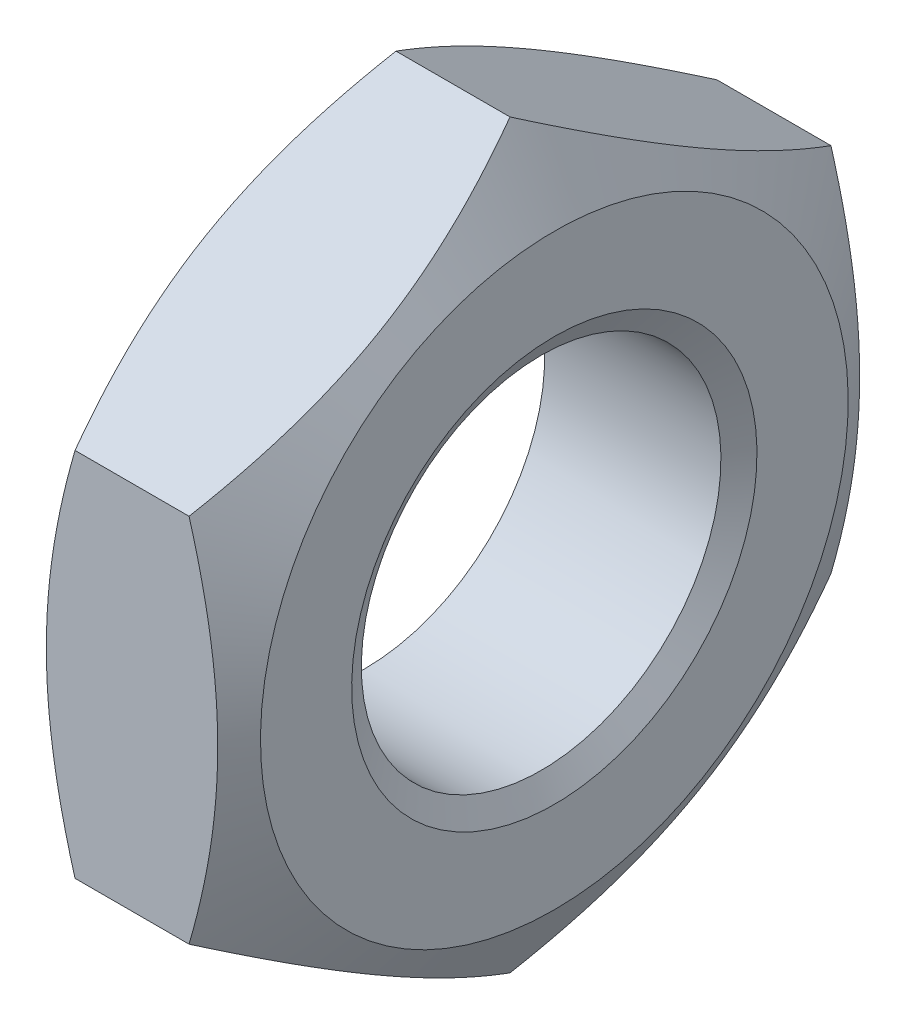
ISO-10303-21;
HEADER;
FILE_DESCRIPTION(('STEP AP214'),'2;1');
FILE_NAME('part.step','',(''),(''),'','','');
FILE_SCHEMA(('AUTOMOTIVE_DESIGN { 1 0 10303 214 1 1 1 1 }'));
ENDSEC;
DATA;
#1=APPLICATION_CONTEXT('core data for automotive mechanical design processes');
#2=APPLICATION_PROTOCOL_DEFINITION('international standard','automotive_design',2000,#1);
#3=PRODUCT_CONTEXT('',#1,'mechanical');
#4=PRODUCT('Part','Part','',(#3));
#5=PRODUCT_RELATED_PRODUCT_CATEGORY('part','',(#4));
#6=PRODUCT_DEFINITION_FORMATION('','',#4);
#7=PRODUCT_DEFINITION_CONTEXT('part definition',#1,'design');
#8=PRODUCT_DEFINITION('design','',#6,#7);
#9=PRODUCT_DEFINITION_SHAPE('','',#8);
#10=(LENGTH_UNIT() NAMED_UNIT(*) SI_UNIT(.MILLI.,.METRE.));
#11=(NAMED_UNIT(*) PLANE_ANGLE_UNIT() SI_UNIT($,.RADIAN.));
#12=(NAMED_UNIT(*) SI_UNIT($,.STERADIAN.) SOLID_ANGLE_UNIT());
#13=UNCERTAINTY_MEASURE_WITH_UNIT(LENGTH_MEASURE(1.E-05),#10,'distance_accuracy_value','');
#14=(GEOMETRIC_REPRESENTATION_CONTEXT(3) GLOBAL_UNCERTAINTY_ASSIGNED_CONTEXT((#13)) GLOBAL_UNIT_ASSIGNED_CONTEXT((#10,
#11,#12)) REPRESENTATION_CONTEXT('',''));
#15=CARTESIAN_POINT('',(0.,0.,0.));
#16=DIRECTION('',(0.,0.,1.));
#17=DIRECTION('',(1.,0.,0.));
#18=AXIS2_PLACEMENT_3D('',#15,#16,#17);
#19=CARTESIAN_POINT('',(-7.21911434E-13,-5.48625,-9.50246374302414));
#20=DIRECTION('',(0.,0.,1.));
#21=DIRECTION('',(1.,0.,0.));
#22=AXIS2_PLACEMENT_3D('',#19,#20,#21);
#23=PLANE('',#22);
#24=DIRECTION('',(1.,0.,0.));
#25=VECTOR('',#24,1.);
#26=CARTESIAN_POINT('',(-3.6095559E-13,-5.4862500000004,-9.50246374302334));
#27=LINE('',#26,#25);
#28=CARTESIAN_POINT('',(4.68797152402466,-5.48625002177249,-9.50246370531297));
#29=VERTEX_POINT('',#28);
#30=CARTESIAN_POINT('',(1.31202847597533,-5.48624995645592,-9.50246374302374));
#31=VERTEX_POINT('',#30);
#32=EDGE_CURVE('E238',#29,#31,#27,.F.);
#33=ORIENTED_EDGE('',*,*,#32,.T.);
#34=CARTESIAN_POINT('',(1.31202846320285,5.48624991297025,-9.50246374335927));
#35=CARTESIAN_POINT('',(1.24241416898941,5.24505231807074,-9.50246374314747));
#36=CARTESIAN_POINT('',(1.17595963283948,5.00295541485009,-9.50246374305788));
#37=CARTESIAN_POINT('',(1.05024678655648,4.51682019456146,-9.50246374299039));
#38=CARTESIAN_POINT('',(0.990990843237799,4.27278126692717,-9.50246374301254));
#39=CARTESIAN_POINT('',(0.825167724011102,3.53673246760537,-9.5024637430474));
#40=CARTESIAN_POINT('',(0.730849395999473,3.04181700924532,-9.50246374302833));
#41=CARTESIAN_POINT('',(0.620254311530401,2.30119872482539,-9.5024637430221));
#42=CARTESIAN_POINT('',(0.588750314906054,2.05770839627848,-9.50246374302359));
#43=CARTESIAN_POINT('',(0.535921065051073,1.56960050198722,-9.50246374302469));
#44=CARTESIAN_POINT('',(0.514596007764625,1.3249829146347,-9.50246374302429));
#45=CARTESIAN_POINT('',(0.482671035738472,0.835339799736361,-9.50246374302399));
#46=CARTESIAN_POINT('',(0.472058376909674,0.590315105097074,-9.5024637430241));
#47=CARTESIAN_POINT('',(0.461783702596514,0.10003951441713,-9.50246374302418));
#48=CARTESIAN_POINT('',(0.462121348688037,-0.145211374398644,-9.50246374302415));
#49=CARTESIAN_POINT('',(0.472984718646372,-0.60369884951824,-9.50246374302413));
#50=CARTESIAN_POINT('',(0.482185246757152,-0.816967825666407,-9.50246374302414));
#51=CARTESIAN_POINT('',(0.508688389095336,-1.24300696727613,-9.50246374302414));
#52=CARTESIAN_POINT('',(0.525991576317283,-1.45577709639118,-9.50246374302414));
#53=CARTESIAN_POINT('',(0.589646094293875,-2.0932630105522,-9.50246374302414));
#54=CARTESIAN_POINT('',(0.647734449937317,-2.51685044221371,-9.50246374302414));
#55=CARTESIAN_POINT('',(0.792953333022717,-3.36851795068179,-9.50246374302414));
#56=CARTESIAN_POINT('',(0.88069931228453,-3.79648935802035,-9.50246374302414));
#57=CARTESIAN_POINT('',(1.07984527387688,-4.64605075999956,-9.50246374302414));
#58=CARTESIAN_POINT('',(1.1911984954162,-5.0676516302362,-9.50246374302414));
#59=CARTESIAN_POINT('',(1.31202846342071,-5.48624991296476,-9.50246374302414));
#60=B_SPLINE_CURVE_WITH_KNOTS('',3,(#34,#35,#36,#37,#38,#39,#40,#41,#42,#43,#44,#45,#46,#47,#48,
#49,#50,#51,#52,#53,#54,#55,#56,#57,#58,#59),.UNSPECIFIED.,.F.,.F.,(4,2,2,2,2,2,2,2,2,2,2,2,4),
(0.,0.753067850575033,1.50638263488569,3.01621866683521,3.75260710407262,4.48900971618733,
5.22453522494729,5.9600380019812,6.60028048040558,7.24056824160149,8.52205341153723,
9.83195578063552,11.1392873645493),.UNSPECIFIED.);
#61=CARTESIAN_POINT('',(1.31202849328387,5.48624999179342,-9.50246375723879));
#62=VERTEX_POINT('',#61);
#63=EDGE_CURVE('E173',#62,#31,#60,.T.);
#64=ORIENTED_EDGE('',*,*,#63,.F.);
#65=DIRECTION('',(1.,0.,0.));
#66=VECTOR('',#65,1.);
#67=CARTESIAN_POINT('',(-1.127986568E-13,5.48625000000025,-9.50246374302415));
#68=LINE('',#67,#66);
#69=CARTESIAN_POINT('',(4.68797150671591,5.48625001641448,-9.50246374302415));
#70=VERTEX_POINT('',#69);
#71=EDGE_CURVE('E73',#62,#70,#68,.T.);
#72=ORIENTED_EDGE('',*,*,#71,.T.);
#73=CARTESIAN_POINT('',(4.68797147951634,-5.48625002634446,-9.50246370585765));
#74=CARTESIAN_POINT('',(4.75758578987443,-5.24505243321223,-9.50246372934711));
#75=CARTESIAN_POINT('',(4.82404033387559,-5.00295552947283,-9.50246373928273));
#76=CARTESIAN_POINT('',(4.94975318823877,-4.51682030614018,-9.50246374676678));
#77=CARTESIAN_POINT('',(5.00900913178715,-4.27278137598075,-9.50246374431116));
#78=CARTESIAN_POINT('',(5.17483225377812,-3.53673256976913,-9.50246374044463));
#79=CARTESIAN_POINT('',(5.26915058645976,-3.04181710756655,-9.50246374255947));
#80=CARTESIAN_POINT('',(5.37974567608272,-2.30119881712656,-9.50246374325077));
#81=CARTESIAN_POINT('',(5.41124967409865,-2.05770848671313,-9.50246374308486));
#82=CARTESIAN_POINT('',(5.46407892677028,-1.56960058868873,-9.50246374296342));
#83=CARTESIAN_POINT('',(5.48540398548291,-1.32498299946972,-9.50246374300789));
#84=CARTESIAN_POINT('',(5.51732896020026,-0.835339880723159,-9.50246374304038));
#85=CARTESIAN_POINT('',(5.52794162029224,-0.590315184102088,-9.50246374302847));
#86=CARTESIAN_POINT('',(5.53821629697361,-0.10003958939449,-9.50246374301981));
#87=CARTESIAN_POINT('',(5.53787865198657,0.145211301467165,-9.50246374302305));
#88=CARTESIAN_POINT('',(5.52701528376784,0.603698786309215,-9.50246374302509));
#89=CARTESIAN_POINT('',(5.51781475608904,0.816967770122968,-9.5024637430244));
#90=CARTESIAN_POINT('',(5.49131161401613,1.24300692705048,-9.50246374302388));
#91=CARTESIAN_POINT('',(5.47400842662736,1.45577706381773,-9.50246374302405));
#92=CARTESIAN_POINT('',(5.41035390728754,2.09326300085836,-9.50246374302432));
#93=CARTESIAN_POINT('',(5.35226554958331,2.51685044768235,-9.50246374302419));
#94=CARTESIAN_POINT('',(5.20704666029475,3.36851798714642,-9.50246374302409));
#95=CARTESIAN_POINT('',(5.11930067680058,3.79648941030171,-9.50246374302412));
#96=CARTESIAN_POINT('',(4.92015470522221,4.64605084345623,-9.50246374302417));
#97=CARTESIAN_POINT('',(4.8088014779322,5.0676517290523,-9.5024637430242));
#98=CARTESIAN_POINT('',(4.68797150368398,5.48625002691739,-9.50246374302414));
#99=B_SPLINE_CURVE_WITH_KNOTS('',3,(#73,#74,#75,#76,#77,#78,#79,#80,#81,#82,#83,#84,#85,#86,#87,
#88,#89,#90,#91,#92,#93,#94,#95,#96,#97,#98),.UNSPECIFIED.,.F.,.F.,(4,2,2,2,2,2,2,2,2,2,2,2,4),
(0.,0.753067858300217,1.50638264999995,3.01621869620813,3.75260713948897,4.48900975756584,
5.22453527241949,5.96003805558283,6.60028055690766,7.24056834101077,8.52205355672466,
9.83195597478756,11.1392876075711),.UNSPECIFIED.);
#100=EDGE_CURVE('E94',#29,#70,#99,.T.);
#101=ORIENTED_EDGE('',*,*,#100,.F.);
#102=EDGE_LOOP('',(#33,#64,#72,#101));
#103=FACE_BOUND('',#102,.T.);
#104=ADVANCED_FACE('F16',(#103),#23,.F.);
#105=CARTESIAN_POINT('',(-3.6095559E-13,-10.9724999999998,7.21911434E-13));
#106=DIRECTION('',(0.,0.866025403784446,0.499999999999988));
#107=DIRECTION('',(0.,-0.499999999999988,0.866025403784446));
#108=AXIS2_PLACEMENT_3D('',#105,#106,#107);
#109=PLANE('',#108);
#110=DIRECTION('',(1.,0.,0.));
#111=VECTOR('',#110,1.);
#112=CARTESIAN_POINT('',(-7.21911434E-13,-10.9725000000011,-1.32532873564628E-12));
#113=LINE('',#112,#111);
#114=CARTESIAN_POINT('',(4.68797151536978,-10.9724999932181,1.17470982850007E-08));
#115=VERTEX_POINT('',#114);
#116=CARTESIAN_POINT('',(1.31202847597568,-10.9724999782283,-3.77107745076369E-08));
#117=VERTEX_POINT('',#116);
#118=EDGE_CURVE('E232',#115,#117,#113,.F.);
#119=ORIENTED_EDGE('',*,*,#118,.T.);
#120=CARTESIAN_POINT('',(1.31202852048292,-5.48624995464152,-9.50246374725492));
#121=CARTESIAN_POINT('',(1.24241421013029,-5.60684877154068,-9.29358051603136));
#122=CARTESIAN_POINT('',(1.17595966613403,-5.72789723200549,-9.08391845219938));
#123=CARTESIAN_POINT('',(1.05024681177941,-5.97096485013437,-8.66291300289337));
#124=CARTESIAN_POINT('',(0.990990868234681,-6.09298431307801,-8.45156908865149));
#125=CARTESIAN_POINT('',(0.82516774625371,-6.46100871280435,-7.81413212216743));
#126=CARTESIAN_POINT('',(0.730849413576017,-6.70846644571533,-7.38552276026944));
#127=CARTESIAN_POINT('',(0.620254323946976,-7.07877559152142,-6.74412850660843));
#128=CARTESIAN_POINT('',(0.588750325925642,-7.20052075659391,-6.53325969479519));
#129=CARTESIAN_POINT('',(0.535921073244654,-7.44457470552009,-6.11054585522432));
#130=CARTESIAN_POINT('',(0.514596014528072,-7.56688350017781,-5.89870080875356));
#131=CARTESIAN_POINT('',(0.482671039804314,-7.81170505959975,-5.4746574291115));
#132=CARTESIAN_POINT('',(0.472058379709958,-7.93421740791079,-5.26245981725839));
#133=CARTESIAN_POINT('',(0.461783703025933,-8.17935520527851,-4.83786869734463));
#134=CARTESIAN_POINT('',(0.462121348012642,-8.30198065072276,-4.62547519554091));
#135=CARTESIAN_POINT('',(0.47298471611764,-8.53122439074984,-4.22841339050095));
#136=CARTESIAN_POINT('',(0.482185243495212,-8.63785888025219,-4.04371703684233));
#137=CARTESIAN_POINT('',(0.508688384605446,-8.85087845392206,-3.6747563122384));
#138=CARTESIAN_POINT('',(0.525991571332694,-8.95726351991633,-3.49049197277008));
#139=CARTESIAN_POINT('',(0.589646088180247,-9.27600648128791,-2.93841296912007));
#140=CARTESIAN_POINT('',(0.647734443546805,-9.48780019997439,-2.57157548763087));
#141=CARTESIAN_POINT('',(0.792953327004909,-9.91363396014791,-1.834009779432));
#142=CARTESIAN_POINT('',(0.880699306964032,-10.1276196668973,-1.46337566324855));
#143=CARTESIAN_POINT('',(1.07984527070353,-10.5524003739937,-0.727633896482561));
#144=CARTESIAN_POINT('',(1.19119849369438,-10.7632008121386,-0.362516827357979));
#145=CARTESIAN_POINT('',(1.31202846342056,-10.9724999564822,-7.53740402310788E-08));
#146=B_SPLINE_CURVE_WITH_KNOTS('',3,(#120,#121,#122,#123,#124,#125,#126,#127,#128,#129,#130,
#131,#132,#133,#134,#135,#136,#137,#138,#139,#140,#141,#142,#143,#144,#145),.UNSPECIFIED.,.F.,
.F.,(4,2,2,2,2,2,2,2,2,2,2,2,4),(0.,0.753067858242465,1.50638264988453,3.01621869596253,
3.75260713930168,4.48900975743753,5.22453527235646,5.96003805558257,6.60028054246969,
7.24056831213074,8.52205349887336,9.83195588646053,11.1392874890004),.UNSPECIFIED.);
#147=EDGE_CURVE('E163',#31,#117,#146,.T.);
#148=ORIENTED_EDGE('',*,*,#147,.F.);
#149=ORIENTED_EDGE('',*,*,#32,.F.);
#150=CARTESIAN_POINT('',(4.6879715081576,-10.9724999688802,-1.70702671167259E-08));
#151=CARTESIAN_POINT('',(4.75758581044036,-10.851901181956,-0.208883266630894));
#152=CARTESIAN_POINT('',(4.82404035051331,-10.7308527344839,-0.418545337675484));
#153=CARTESIAN_POINT('',(4.94975320083198,-10.4877851267993,-0.839550791275659));
#154=CARTESIAN_POINT('',(5.00900914426367,-10.3657656613019,-1.05089470259612));
#155=CARTESIAN_POINT('',(5.17483226486745,-9.99774125827504,-1.68833166323242));
#156=CARTESIAN_POINT('',(5.26915059521204,-9.75028352905278,-2.1169410250667));
#157=CARTESIAN_POINT('',(5.37974568226102,-9.37997438564077,-2.75833527664867));
#158=CARTESIAN_POINT('',(5.41124967958385,-9.25822922082478,-2.96920408752141));
#159=CARTESIAN_POINT('',(5.4640789308518,-9.01417527268421,-3.39191792536833));
#160=CARTESIAN_POINT('',(5.4854039888533,-8.89186647855557,-3.60376297105569));
#161=CARTESIAN_POINT('',(5.51732896222824,-8.64704492014806,-4.0278063490379));
#162=CARTESIAN_POINT('',(5.52794162168981,-8.52453257232247,-4.24000396001458));
#163=CARTESIAN_POINT('',(5.53821629718839,-8.27939477596119,-4.66459507815922));
#164=CARTESIAN_POINT('',(5.53787865164928,-8.15676933103794,-4.87698857907025));
#165=CARTESIAN_POINT('',(5.52701528261761,-7.92752559224627,-5.27405038197649));
#166=CARTESIAN_POINT('',(5.51781475487344,-7.82089110345748,-5.45874673439714));
#167=CARTESIAN_POINT('',(5.49131161314925,-7.60787153121969,-5.82770745651909));
#168=CARTESIAN_POINT('',(5.47400842617466,-7.50148646594394,-6.01197179474338));
#169=CARTESIAN_POINT('',(5.41035390876261,-7.18274350671816,-6.56405079467757));
#170=CARTESIAN_POINT('',(5.35226555325764,-6.97094978945945,-6.93088827369342));
#171=CARTESIAN_POINT('',(5.20704666998596,-6.54511603225562,-7.66845397674831));
#172=CARTESIAN_POINT('',(5.11930069037553,-6.33113032704633,-8.0390880902643));
#173=CARTESIAN_POINT('',(4.9201547277097,-5.9063496230034,-8.77482985174162));
#174=CARTESIAN_POINT('',(4.80880150544467,-5.69554918637187,-9.13994691824517));
#175=CARTESIAN_POINT('',(4.68797153657938,-5.4862500435179,-9.50246366764882));
#176=B_SPLINE_CURVE_WITH_KNOTS('',3,(#150,#151,#152,#153,#154,#155,#156,#157,#158,#159,#160,
#161,#162,#163,#164,#165,#166,#167,#168,#169,#170,#171,#172,#173,#174,#175),.UNSPECIFIED.,.F.,
.F.,(4,2,2,2,2,2,2,2,2,2,2,2,4),(0.,0.753067854408625,1.50638264238487,3.01621868139841,
3.75260712168659,4.48900973681179,5.22453524865115,5.96003802878106,6.60028051143676,
7.24056827686518,8.52205345520425,9.83195583354684,11.1392874267735),.UNSPECIFIED.);
#177=EDGE_CURVE('E133',#115,#29,#176,.T.);
#178=ORIENTED_EDGE('',*,*,#177,.F.);
#179=EDGE_LOOP('',(#119,#148,#149,#178));
#180=FACE_BOUND('',#179,.T.);
#181=ADVANCED_FACE('F149',(#180),#109,.F.);
#182=CARTESIAN_POINT('',(-7.21911434E-13,-5.48625,9.50246374302559));
#183=DIRECTION('',(0.,0.866025403784446,-0.499999999999988));
#184=DIRECTION('',(0.,0.499999999999988,0.866025403784446));
#185=AXIS2_PLACEMENT_3D('',#182,#183,#184);
#186=PLANE('',#185);
#187=DIRECTION('',(-1.,0.,0.));
#188=VECTOR('',#187,1.);
#189=CARTESIAN_POINT('',(-1.353584034E-13,-5.48625000000178,9.50246374302559));
#190=LINE('',#189,#188);
#191=CARTESIAN_POINT('',(4.68797152402393,-5.48624995645737,9.50246374302559));
#192=VERTEX_POINT('',#191);
#193=CARTESIAN_POINT('',(1.31202847597572,-5.48625002177304,9.50246370531511));
#194=VERTEX_POINT('',#193);
#195=EDGE_CURVE('E230',#192,#194,#190,.T.);
#196=ORIENTED_EDGE('',*,*,#195,.T.);
#197=CARTESIAN_POINT('',(1.31202852048283,-10.9724999809846,-4.13962033038982E-08));
#198=CARTESIAN_POINT('',(1.2424142101302,-10.85190120477,0.208883213316594));
#199=CARTESIAN_POINT('',(1.17595966613395,-10.7308527615141,0.418545287084108));
#200=CARTESIAN_POINT('',(1.05024681177934,-10.4877851563478,0.839550743874099));
#201=CARTESIAN_POINT('',(0.99099086823462,-10.365765689151,1.05089465566037));
#202=CARTESIAN_POINT('',(0.825167746253664,-9.99774128272768,1.68833161827793));
#203=CARTESIAN_POINT('',(0.730849413575981,-9.75028355347969,2.11694098229074));
#204=CARTESIAN_POINT('',(0.620254323946958,-9.37997440887095,2.75833523664305));
#205=CARTESIAN_POINT('',(0.588750325925631,-9.2582292435111,2.96920404829037));
#206=CARTESIAN_POINT('',(0.535921073244653,-9.01417529437458,3.39191788773979));
#207=CARTESIAN_POINT('',(0.514596014528076,-8.89186649979387,3.60376293425501));
#208=CARTESIAN_POINT('',(0.482671039804329,-8.64704494042822,4.02780631392957));
#209=CARTESIAN_POINT('',(0.472058379709978,-8.52453259209656,4.24000392577077));
#210=CARTESIAN_POINT('',(0.461783703025963,-8.27939479471384,4.66459504567585));
#211=CARTESIAN_POINT('',(0.462121348012675,-8.15676934927521,4.87698854748282));
#212=CARTESIAN_POINT('',(0.472984716117683,-7.92752560925165,5.27405035252482));
#213=CARTESIAN_POINT('',(0.482185243495259,-7.82089111974812,5.45874670618274));
#214=CARTESIAN_POINT('',(0.508688384605502,-7.60787154607734,5.82770743078616));
#215=CARTESIAN_POINT('',(0.525991571332754,-7.50148648008336,6.01197177025465));
#216=CARTESIAN_POINT('',(0.58964608818032,-7.18274351871225,6.56405077390493));
#217=CARTESIAN_POINT('',(0.647734443546886,-6.97094980002555,6.93088825539401));
#218=CARTESIAN_POINT('',(0.792953327005006,-6.54511603985184,7.66845396359278));
#219=CARTESIAN_POINT('',(0.880699306964137,-6.33113033310249,8.03908807977626));
#220=CARTESIAN_POINT('',(1.07984527070365,-5.90634962600614,8.77482984654231));
#221=CARTESIAN_POINT('',(1.19119849369451,-5.69554918786135,9.13994691566692));
#222=CARTESIAN_POINT('',(1.31202846342069,-5.48625004351765,9.50246366765081));
#223=B_SPLINE_CURVE_WITH_KNOTS('',3,(#197,#198,#199,#200,#201,#202,#203,#204,#205,#206,#207,
#208,#209,#210,#211,#212,#213,#214,#215,#216,#217,#218,#219,#220,#221,#222),.UNSPECIFIED.,.F.,
.F.,(4,2,2,2,2,2,2,2,2,2,2,2,4),(0.,0.753067858242452,1.50638264988451,3.01621869596249,
3.75260713930163,4.48900975743747,5.22453527235639,5.96003805558248,6.60028054246962,
7.24056831213067,8.5220534988733,9.83195588646049,11.1392874890003),.UNSPECIFIED.);
#224=EDGE_CURVE('E155',#117,#194,#223,.T.);
#225=ORIENTED_EDGE('',*,*,#224,.F.);
#226=ORIENTED_EDGE('',*,*,#118,.F.);
#227=CARTESIAN_POINT('',(4.68797147951742,-5.48624995464228,9.50246374725617));
#228=CARTESIAN_POINT('',(4.75758578987249,-5.6068487715458,9.29358051602442));
#229=CARTESIAN_POINT('',(4.82404033387105,-5.72789723201514,9.0839184521843));
#230=CARTESIAN_POINT('',(4.9497531882298,-5.97096485015329,8.66291300286204));
#231=CARTESIAN_POINT('',(5.00900913177635,-6.09298431310167,8.45156908861203));
#232=CARTESIAN_POINT('',(5.17483225376227,-6.46100871284349,7.81413212210126));
#233=CARTESIAN_POINT('',(5.26915058644186,-6.70846644576531,7.38552276018443));
#234=CARTESIAN_POINT('',(5.37974567606779,-7.07877559157764,6.74412850651261));
#235=CARTESIAN_POINT('',(5.4112496740864,-7.20052075664538,6.53325969470759));
#236=CARTESIAN_POINT('',(5.46407892676267,-7.44457470556195,6.11054585515337));
#237=CARTESIAN_POINT('',(5.48540398547726,-7.56688350021481,5.89870080869104));
#238=CARTESIAN_POINT('',(5.51732896019778,-7.81170505962645,5.4746574290668));
#239=CARTESIAN_POINT('',(5.52794162029094,-7.93421740793207,5.26245981722308));
#240=CARTESIAN_POINT('',(5.53821629697361,-8.17935520528904,4.83786869732794));
#241=CARTESIAN_POINT('',(5.53787865198673,-8.30198065072797,4.62547519553344));
#242=CARTESIAN_POINT('',(5.52701528382485,-8.53122439195289,4.22841338841877));
#243=CARTESIAN_POINT('',(5.51781475629666,-8.6378588826572,4.04371703267828));
#244=CARTESIAN_POINT('',(5.49131161470507,-8.85087845872379,3.67475630392312));
#245=CARTESIAN_POINT('',(5.47400842764706,-8.95726352591281,3.49049196238543));
#246=CARTESIAN_POINT('',(5.41035390955336,-9.27600649085887,2.93841295254423));
#247=CARTESIAN_POINT('',(5.35226555301796,-9.48780021190806,2.57157546696271));
#248=CARTESIAN_POINT('',(5.20704666664463,-9.91363397686079,1.83400975048601));
#249=CARTESIAN_POINT('',(5.11930068491798,-10.1276196860243,1.46337563012116));
#250=CARTESIAN_POINT('',(4.92015471725906,-10.5524003978612,0.727633855144506));
#251=CARTESIAN_POINT('',(4.80880149211864,-10.7632008383326,0.362516781990115));
#252=CARTESIAN_POINT('',(4.68797152013145,-10.9724999849707,2.60320839123683E-08));
#253=B_SPLINE_CURVE_WITH_KNOTS('',3,(#227,#228,#229,#230,#231,#232,#233,#234,#235,#236,#237,
#238,#239,#240,#241,#242,#243,#244,#245,#246,#247,#248,#249,#250,#251,#252),.UNSPECIFIED.,.F.,
.F.,(4,2,2,2,2,2,2,2,2,2,2,2,4),(0.,0.753067858271214,1.50638264994199,3.01621869608486,
3.75260713939476,4.48900975750103,5.22453527238722,5.96003805558185,6.60028054968783,
7.24056832656992,8.52205352779819,9.83195593062323,11.1392875482849),.UNSPECIFIED.);
#254=EDGE_CURVE('E98',#192,#115,#253,.T.);
#255=ORIENTED_EDGE('',*,*,#254,.F.);
#256=EDGE_LOOP('',(#196,#225,#226,#255));
#257=FACE_BOUND('',#256,.T.);
#258=ADVANCED_FACE('F145',(#257),#186,.F.);
#259=CARTESIAN_POINT('',(-1.353584034E-13,5.48625000000033,9.50246374302559));
#260=DIRECTION('',(0.,0.,-1.));
#261=DIRECTION('',(-1.,0.,0.));
#262=AXIS2_PLACEMENT_3D('',#259,#260,#261);
#263=PLANE('',#262);
#264=DIRECTION('',(1.,0.,0.));
#265=VECTOR('',#264,1.);
#266=CARTESIAN_POINT('',(-4.96314222E-13,5.48624999999939,9.50246374302708));
#267=LINE('',#266,#265);
#268=CARTESIAN_POINT('',(4.68797152402397,5.48625002177157,9.50246370531655));
#269=VERTEX_POINT('',#268);
#270=CARTESIAN_POINT('',(1.31202847597578,5.48624995645563,9.50246374302633));
#271=VERTEX_POINT('',#270);
#272=EDGE_CURVE('E85',#269,#271,#267,.F.);
#273=ORIENTED_EDGE('',*,*,#272,.T.);
#274=CARTESIAN_POINT('',(1.31202852048299,-5.48625002634329,9.5024637058594));
#275=CARTESIAN_POINT('',(1.24241421013035,-5.24505243322953,9.50246372934867));
#276=CARTESIAN_POINT('',(1.17595966613409,-5.00295552950875,9.5024637392842));
#277=CARTESIAN_POINT('',(1.05024681177946,-4.51682030621362,9.5024637467682));
#278=CARTESIAN_POINT('',(0.990990868234735,-4.27278137607309,9.50246374431259));
#279=CARTESIAN_POINT('',(0.825167746253768,-3.53673256992342,9.5024637404461));
#280=CARTESIAN_POINT('',(0.730849413576076,-3.04181710776443,9.50246374256092));
#281=CARTESIAN_POINT('',(0.620254323947038,-2.30119881734957,9.50246374325222));
#282=CARTESIAN_POINT('',(0.588750325925706,-2.05770848691723,9.50246374308631));
#283=CARTESIAN_POINT('',(0.53592107324472,-1.5696005888545,9.50246374296487));
#284=CARTESIAN_POINT('',(0.514596014528139,-1.32498299961606,9.50246374300933));
#285=CARTESIAN_POINT('',(0.482671039804384,-0.835339880828442,9.50246374304183));
#286=CARTESIAN_POINT('',(0.47205837971003,-0.590315184185741,9.50246374302992));
#287=CARTESIAN_POINT('',(0.461783703026007,-0.10003958943528,9.50246374302126));
#288=CARTESIAN_POINT('',(0.462121348012717,0.145211301447607,9.5024637430245));
#289=CARTESIAN_POINT('',(0.472984716117719,0.603698781498286,9.50246374302654));
#290=CARTESIAN_POINT('',(0.482185243495293,0.816967760504193,9.50246374302585));
#291=CARTESIAN_POINT('',(0.508688384605534,1.24300690784489,9.50246374302533));
#292=CARTESIAN_POINT('',(0.525991571332786,1.45577703983317,9.5024637430255));
#293=CARTESIAN_POINT('',(0.589646088180353,2.09326296257592,9.50246374302577));
#294=CARTESIAN_POINT('',(0.647734443546922,2.51685039994915,9.50246374302564));
#295=CARTESIAN_POINT('',(0.792953327005052,3.36851792029647,9.50246374302553));
#296=CARTESIAN_POINT('',(0.880699306964191,3.79648933379527,9.50246374302556));
#297=CARTESIAN_POINT('',(1.07984527070372,4.64605074798816,9.50246374302561));
#298=CARTESIAN_POINT('',(1.19119849369459,5.06765162427781,9.50246374302564));
#299=CARTESIAN_POINT('',(1.31202846342079,5.48624991296517,9.50246374302559));
#300=B_SPLINE_CURVE_WITH_KNOTS('',3,(#274,#275,#276,#277,#278,#279,#280,#281,#282,#283,#284,
#285,#286,#287,#288,#289,#290,#291,#292,#293,#294,#295,#296,#297,#298,#299),.UNSPECIFIED.,.F.,
.F.,(4,2,2,2,2,2,2,2,2,2,2,2,4),(0.,0.753067858242473,1.50638264988455,3.01621869596257,
3.75260713930173,4.48900975743758,5.22453527235653,5.96003805558264,6.60028054246982,
7.24056831213093,8.52205349887366,9.83195588646096,11.1392874890009),.UNSPECIFIED.);
#301=EDGE_CURVE('E162',#194,#271,#300,.T.);
#302=ORIENTED_EDGE('',*,*,#301,.F.);
#303=ORIENTED_EDGE('',*,*,#195,.F.);
#304=CARTESIAN_POINT('',(4.6879714795174,5.48625002634294,9.50246370585988));
#305=CARTESIAN_POINT('',(4.75758578986983,5.24505243322916,9.50246372934884));
#306=CARTESIAN_POINT('',(4.82404033386597,5.00295552950838,9.50246373928425));
#307=CARTESIAN_POINT('',(4.94975318822048,4.51682030621329,9.50246374676815));
#308=CARTESIAN_POINT('',(5.00900913176519,4.27278137607279,9.50246374431258));
#309=CARTESIAN_POINT('',(5.1748322537461,3.53673256992322,9.50246374044613));
#310=CARTESIAN_POINT('',(5.26915058642372,3.04181710776428,9.50246374256093));
#311=CARTESIAN_POINT('',(5.37974567605269,2.30119881734951,9.50246374325221));
#312=CARTESIAN_POINT('',(5.41124967407401,2.05770848691719,9.50246374308631));
#313=CARTESIAN_POINT('',(5.46407892675496,1.56960058885451,9.50246374296487));
#314=CARTESIAN_POINT('',(5.48540398547153,1.32498299961609,9.50246374300933));
#315=CARTESIAN_POINT('',(5.51732896019527,0.83533988082853,9.50246374304183));
#316=CARTESIAN_POINT('',(5.52794162028961,0.590315184185856,9.50246374302992));
#317=CARTESIAN_POINT('',(5.53821629697363,0.100039589435447,9.50246374302126));
#318=CARTESIAN_POINT('',(5.53787865198692,-0.145211301447412,9.5024637430245));
#319=CARTESIAN_POINT('',(5.52701528388192,-0.60369878149812,9.50246374302654));
#320=CARTESIAN_POINT('',(5.51781475650434,-0.816967760504082,9.50246374302585));
#321=CARTESIAN_POINT('',(5.4913116153941,-1.24300690784489,9.50246374302533));
#322=CARTESIAN_POINT('',(5.47400842866685,-1.45577703983322,9.5024637430255));
#323=CARTESIAN_POINT('',(5.41035391181927,-2.09326296257614,9.50246374302577));
#324=CARTESIAN_POINT('',(5.35226555645269,-2.51685039994948,9.50246374302564));
#325=CARTESIAN_POINT('',(5.20704667299454,-3.36851792029702,9.50246374302553));
#326=CARTESIAN_POINT('',(5.11930069303539,-3.79648933379592,9.50246374302556));
#327=CARTESIAN_POINT('',(4.92015472929583,-4.64605074798903,9.50246374302561));
#328=CARTESIAN_POINT('',(4.80880150630495,-5.06765162427879,9.50246374302564));
#329=CARTESIAN_POINT('',(4.68797153657874,-5.48624991296625,9.50246374302559));
#330=B_SPLINE_CURVE_WITH_KNOTS('',3,(#304,#305,#306,#307,#308,#309,#310,#311,#312,#313,#314,
#315,#316,#317,#318,#319,#320,#321,#322,#323,#324,#325,#326,#327,#328,#329),.UNSPECIFIED.,.F.,
.F.,(4,2,2,2,2,2,2,2,2,2,2,2,4),(0.,0.753067858242366,1.50638264988434,3.01621869596216,
3.75260713930124,4.48900975743701,5.22453527235588,5.96003805558191,6.60028054246926,
7.24056831213053,8.52205349887359,9.83195588646121,11.1392874890015),.UNSPECIFIED.);
#331=EDGE_CURVE('E97',#269,#192,#330,.T.);
#332=ORIENTED_EDGE('',*,*,#331,.F.);
#333=EDGE_LOOP('',(#273,#302,#303,#332));
#334=FACE_BOUND('',#333,.T.);
#335=ADVANCED_FACE('F148',(#334),#263,.F.);
#336=CARTESIAN_POINT('',(-4.96314222E-13,10.9725000000001,7.21911434E-13));
#337=DIRECTION('',(0.,-0.866025403784449,-0.499999999999982));
#338=DIRECTION('',(0.,0.499999999999982,-0.866025403784449));
#339=AXIS2_PLACEMENT_3D('',#336,#337,#338);
#340=PLANE('',#339);
#341=DIRECTION('',(1.,0.,0.));
#342=VECTOR('',#341,1.);
#343=CARTESIAN_POINT('',(-1.127986568E-13,10.9725000000013,2.79117007284668E-12));
#344=LINE('',#343,#342);
#345=CARTESIAN_POINT('',(4.6879715240239,10.9724999782291,-3.77078033857955E-08));
#346=VERTEX_POINT('',#345);
#347=CARTESIAN_POINT('',(1.31202848462991,10.972499993218,1.17497384884305E-08));
#348=VERTEX_POINT('',#347);
#349=EDGE_CURVE('E79',#346,#348,#344,.F.);
#350=ORIENTED_EDGE('',*,*,#349,.T.);
#351=CARTESIAN_POINT('',(1.31202852048309,5.48624995464165,9.50246374725645));
#352=CARTESIAN_POINT('',(1.24241421012775,5.60684877154549,9.29358051602492));
#353=CARTESIAN_POINT('',(1.17595966612904,5.72789723201498,9.08391845218488));
#354=CARTESIAN_POINT('',(1.05024681177014,5.97096485015326,8.66291300286264));
#355=CARTESIAN_POINT('',(0.99099086822358,6.09298431310162,8.45156908861258));
#356=CARTESIAN_POINT('',(0.825167746237601,6.46100871284344,7.81413212210167));
#357=CARTESIAN_POINT('',(0.730849413557931,6.70846644576532,7.38552276018481));
#358=CARTESIAN_POINT('',(0.620254323931935,7.07877559157769,6.7441285065129));
#359=CARTESIAN_POINT('',(0.588750325913306,7.20052075664545,6.53325969470786));
#360=CARTESIAN_POINT('',(0.535921073237004,7.44457470556205,6.11054585515358));
#361=CARTESIAN_POINT('',(0.514596014522398,7.56688350021492,5.89870080869123));
#362=CARTESIAN_POINT('',(0.482671039801856,7.81170505962659,5.47465742906694));
#363=CARTESIAN_POINT('',(0.472058379708692,7.93421740793222,5.26245981722319));
#364=CARTESIAN_POINT('',(0.461783703026009,8.17935520528922,4.837868697328));
#365=CARTESIAN_POINT('',(0.462121348012887,8.30198065072816,4.62547519553346));
#366=CARTESIAN_POINT('',(0.472984716174769,8.53122439195306,4.22841338841881));
#367=CARTESIAN_POINT('',(0.48218524370296,8.63785888265735,4.04371703267838));
#368=CARTESIAN_POINT('',(0.508688385294539,8.85087845872388,3.67475630392331));
#369=CARTESIAN_POINT('',(0.525991572352544,8.95726352591287,3.49049196238567));
#370=CARTESIAN_POINT('',(0.589646090446231,9.27600649085884,2.93841295254462));
#371=CARTESIAN_POINT('',(0.64773444698162,9.48780021190796,2.5715754669632));
#372=CARTESIAN_POINT('',(0.792953333354929,9.91363397686057,1.83400975048669));
#373=CARTESIAN_POINT('',(0.88069931508156,10.127619686024,1.46337563012193));
#374=CARTESIAN_POINT('',(1.07984528274045,10.5524003978608,0.727633855145474));
#375=CARTESIAN_POINT('',(1.19119850788085,10.7632008383322,0.362516781991176));
#376=CARTESIAN_POINT('',(1.31202847986803,10.9724999849702,2.60332376370932E-08));
#377=B_SPLINE_CURVE_WITH_KNOTS('',3,(#351,#352,#353,#354,#355,#356,#357,#358,#359,#360,#361,
#362,#363,#364,#365,#366,#367,#368,#369,#370,#371,#372,#373,#374,#375,#376),.UNSPECIFIED.,.F.,
.F.,(4,2,2,2,2,2,2,2,2,2,2,2,4),(0.,0.753067858271343,1.50638264994224,3.01621869608534,
3.75260713939533,4.48900975750169,5.22453527238798,5.9600380555827,6.60028054968851,
7.24056832657043,8.52205352779835,9.83195593062305,11.1392875482844),.UNSPECIFIED.);
#378=EDGE_CURVE('E41',#271,#348,#377,.T.);
#379=ORIENTED_EDGE('',*,*,#378,.F.);
#380=ORIENTED_EDGE('',*,*,#272,.F.);
#381=CARTESIAN_POINT('',(4.68797147951779,10.972499980985,-4.1395213572109E-08));
#382=CARTESIAN_POINT('',(4.75758578987011,10.85190120477,0.208883213317397));
#383=CARTESIAN_POINT('',(4.82404033386621,10.7308527615139,0.418545287084813));
#384=CARTESIAN_POINT('',(4.94975318822066,10.4877851563476,0.839550743874692));
#385=CARTESIAN_POINT('',(5.00900913176537,10.3657656891508,1.05089465566095));
#386=CARTESIAN_POINT('',(5.17483225374627,9.99774128272762,1.68833161827844));
#387=CARTESIAN_POINT('',(5.26915058642387,9.75028355347963,2.11694098229117));
#388=CARTESIAN_POINT('',(5.37974567605281,9.37997440887095,2.75833523664337));
#389=CARTESIAN_POINT('',(5.41124967407412,9.25822924351112,2.96920404829067));
#390=CARTESIAN_POINT('',(5.46407892675506,9.01417529437463,3.39191788774004));
#391=CARTESIAN_POINT('',(5.48540398547162,8.89186649979395,3.60376293425523));
#392=CARTESIAN_POINT('',(5.51732896019535,8.64704494042833,4.02780631392973));
#393=CARTESIAN_POINT('',(5.52794162028969,8.52453259209669,4.2400039257709));
#394=CARTESIAN_POINT('',(5.53821629697369,8.27939479471401,4.66459504567593));
#395=CARTESIAN_POINT('',(5.53787865198698,8.1567693492754,4.87698854748286));
#396=CARTESIAN_POINT('',(5.52701528388197,7.92752560925182,5.27405035252489));
#397=CARTESIAN_POINT('',(5.51781475650439,7.82089111974825,5.45874670618287));
#398=CARTESIAN_POINT('',(5.49131161539414,7.60787154607742,5.8277074307864));
#399=CARTESIAN_POINT('',(5.47400842866689,7.5014864800834,6.01197177025495));
#400=CARTESIAN_POINT('',(5.4103539118193,7.1827435187122,6.56405077390541));
#401=CARTESIAN_POINT('',(5.35226555645272,6.97094980002544,6.9308882553946));
#402=CARTESIAN_POINT('',(5.20704667299456,6.5451160398516,7.6684539635936));
#403=CARTESIAN_POINT('',(5.11930069303541,6.33113033310219,8.03908807977719));
#404=CARTESIAN_POINT('',(4.92015472929586,5.90634962600572,8.77482984654345));
#405=CARTESIAN_POINT('',(4.80880150630497,5.69554918786088,9.13994691566817));
#406=CARTESIAN_POINT('',(4.68797153657876,5.48625004351712,9.50246366765217));
#407=B_SPLINE_CURVE_WITH_KNOTS('',3,(#381,#382,#383,#384,#385,#386,#387,#388,#389,#390,#391,
#392,#393,#394,#395,#396,#397,#398,#399,#400,#401,#402,#403,#404,#405,#406),.UNSPECIFIED.,.F.,
.F.,(4,2,2,2,2,2,2,2,2,2,2,2,4),(0.,0.753067858242311,1.50638264988423,3.01621869596196,
3.75260713930099,4.48900975743672,5.22453527235554,5.96003805558153,6.60028054246886,
7.24056831213011,8.52205349887313,9.83195588646071,11.1392874890009),.UNSPECIFIED.);
#408=EDGE_CURVE('E92',#346,#269,#407,.T.);
#409=ORIENTED_EDGE('',*,*,#408,.F.);
#410=EDGE_LOOP('',(#350,#379,#380,#409));
#411=FACE_BOUND('',#410,.T.);
#412=ADVANCED_FACE('F95',(#411),#340,.F.);
#413=CARTESIAN_POINT('',(-1.127986568E-13,5.48625000000026,-9.50246374302414));
#414=DIRECTION('',(0.,-0.866025403784446,0.499999999999988));
#415=DIRECTION('',(0.,-0.499999999999988,-0.866025403784446));
#416=AXIS2_PLACEMENT_3D('',#413,#414,#415);
#417=PLANE('',#416);
#418=ORIENTED_EDGE('',*,*,#71,.F.);
#419=CARTESIAN_POINT('',(1.31202849184273,10.9724999688801,-1.70698898881004E-08));
#420=CARTESIAN_POINT('',(1.2424141895544,10.8519011819469,-0.20888326664667));
#421=CARTESIAN_POINT('',(1.17595964947648,10.7308527344657,-0.418545337707461));
#422=CARTESIAN_POINT('',(1.05024679914917,10.4877851267624,-0.8395507913402));
#423=CARTESIAN_POINT('',(0.990990855713803,10.3657656612556,-1.05089470267703));
#424=CARTESIAN_POINT('',(0.825167735099968,9.99774125819762,-1.68833166336701));
#425=CARTESIAN_POINT('',(0.730849404751387,9.75028352895357,-2.11694102523908));
#426=CARTESIAN_POINT('',(0.620254317708452,9.37997438552897,-2.75833527684286));
#427=CARTESIAN_POINT('',(0.58875032039103,9.25822922072243,-2.96920408769923));
#428=CARTESIAN_POINT('',(0.535921069132434,9.01417527260102,-3.39191792551297));
#429=CARTESIAN_POINT('',(0.514596011134881,8.89186647848208,-3.60376297118352));
#430=CARTESIAN_POINT('',(0.482671037766371,8.64704492009508,-4.0278063491302));
#431=CARTESIAN_POINT('',(0.472058378307187,8.5245325722803,-4.24000396008816));
#432=CARTESIAN_POINT('',(0.461783702811294,8.27939477594044,-4.6645950781957));
#433=CARTESIAN_POINT('',(0.462121348350754,8.1567693310278,-4.87698857908836));
#434=CARTESIAN_POINT('',(0.472984717496197,7.92752558984048,-5.274050386144));
#435=CARTESIAN_POINT('',(0.482185245541617,7.82089109864779,-5.45874674272831));
#436=CARTESIAN_POINT('',(0.508688388228523,7.60787152161666,-5.82770747315257));
#437=CARTESIAN_POINT('',(0.525991575864643,7.50148645395146,-6.01197181551552));
#438=CARTESIAN_POINT('',(0.589646095768999,7.18274348757684,-6.56405082783186));
#439=CARTESIAN_POINT('',(0.647734453611673,6.97094976559282,-6.93088831503218));
#440=CARTESIAN_POINT('',(0.792953342713861,6.54511599883076,-7.66845403464243));
#441=CARTESIAN_POINT('',(0.880699325859358,6.33113028879329,-8.03908815652107));
#442=CARTESIAN_POINT('',(1.0798452963641,5.90634957526967,-8.77482993441941));
#443=CARTESIAN_POINT('',(1.1911985229283,5.69554913398501,-9.13994700898243));
#444=CARTESIAN_POINT('',(1.31202849631564,5.48624998654223,-9.50246376633412));
#445=B_SPLINE_CURVE_WITH_KNOTS('',3,(#419,#420,#421,#422,#423,#424,#425,#426,#427,#428,#429,
#430,#431,#432,#433,#434,#435,#436,#437,#438,#439,#440,#441,#442,#443,#444),.UNSPECIFIED.,.F.,
.F.,(4,2,2,2,2,2,2,2,2,2,2,2,4),(0.,0.753067854466436,1.5063826425004,3.01621868164423,
3.75260712187414,4.48900973694039,5.22453524871449,5.96003802878168,6.60028052587482,
7.24056830574506,8.52205351305489,9.8319559218727,11.1392875453426),.UNSPECIFIED.);
#446=EDGE_CURVE('E82',#348,#62,#445,.T.);
#447=ORIENTED_EDGE('',*,*,#446,.F.);
#448=ORIENTED_EDGE('',*,*,#349,.F.);
#449=CARTESIAN_POINT('',(4.68797153679763,5.48625004380629,-9.50246366782106));
#450=CARTESIAN_POINT('',(4.75758583101085,5.60684884107237,-9.2935804232003));
#451=CARTESIAN_POINT('',(4.82404036716067,5.72789729260499,-9.08391835478882));
#452=CARTESIAN_POINT('',(4.94975321344354,5.97096490269075,-8.66291290431078));
#453=CARTESIAN_POINT('',(5.0090091567622,6.09298436652708,-8.45156899347828));
#454=CARTESIAN_POINT('',(5.17483227598883,6.46100876621816,-7.81413203485811));
#455=CARTESIAN_POINT('',(5.26915060400039,6.70846649538161,-7.38552267518319));
#456=CARTESIAN_POINT('',(5.37974568846939,7.07877563758611,-6.74412842636523));
#457=CARTESIAN_POINT('',(5.41124968509371,7.20052080186085,-6.53325961626856));
#458=CARTESIAN_POINT('',(5.46407893494866,7.44457474900739,-6.1105457800252));
#459=CARTESIAN_POINT('',(5.4854039922351,7.56688354268329,-5.89870073516528));
#460=CARTESIAN_POINT('',(5.51732896426123,7.81170510013217,-5.47465735887507));
#461=CARTESIAN_POINT('',(5.52794162309002,7.93421744745189,-5.262459748763));
#462=CARTESIAN_POINT('',(5.53821629740316,8.17935524279189,-4.83786863237884));
#463=CARTESIAN_POINT('',(5.53787865131164,8.30198068719974,-4.62547513236367));
#464=CARTESIAN_POINT('',(5.5270152813533,8.53122442475953,-4.22841333159307));
#465=CARTESIAN_POINT('',(5.51781475324252,8.63785891283365,-4.0437169804096));
#466=CARTESIAN_POINT('',(5.49131161090432,8.85087848363858,-3.67475626076894));
#467=CARTESIAN_POINT('',(5.47400842368237,8.95726354819614,-3.49049192378875));
#468=CARTESIAN_POINT('',(5.41035390570576,9.27600650527674,-2.93841292757038));
#469=CARTESIAN_POINT('',(5.35226555006229,9.48780022110757,-2.57157545102758));
#470=CARTESIAN_POINT('',(5.20704666697685,9.91363397534173,-1.83400975311618));
#471=CARTESIAN_POINT('',(5.11930068771501,10.1276196790111,-1.46337564226749));
#472=CARTESIAN_POINT('',(4.9201547261226,10.5524003800008,-0.727633886078532));
#473=CARTESIAN_POINT('',(4.80880150458325,10.7632008151192,-0.362516822195854));
#474=CARTESIAN_POINT('',(4.68797153657872,10.9724999564835,-7.53722594268999E-08));
#475=B_SPLINE_CURVE_WITH_KNOTS('',3,(#449,#450,#451,#452,#453,#454,#455,#456,#457,#458,#459,
#460,#461,#462,#463,#464,#465,#466,#467,#468,#469,#470,#471,#472,#473,#474),.UNSPECIFIED.,.F.,
.F.,(4,2,2,2,2,2,2,2,2,2,2,2,4),(0.,0.753067850574915,1.50638263488546,3.01621866683476,
3.75260710407208,4.4890097161867,5.22453522494657,5.96003800198039,6.60028048040497,
7.2405682416011,8.52205341153726,9.83195578063597,11.1392873645502),.UNSPECIFIED.);
#476=EDGE_CURVE('E20',#70,#346,#475,.T.);
#477=ORIENTED_EDGE('',*,*,#476,.F.);
#478=EDGE_LOOP('',(#418,#447,#448,#477));
#479=FACE_BOUND('',#478,.T.);
#480=ADVANCED_FACE('F81',(#479),#417,.F.);
#481=CARTESIAN_POINT('',(4.68009934097023,1.80496272352521E-13,7.21644966006352E-13));
#482=DIRECTION('',(-1.,0.,0.));
#483=DIRECTION('',(0.,-1.,0.));
#484=AXIS2_PLACEMENT_3D('',#481,#482,#483);
#485=CONICAL_SURFACE('',#484,10.9861349992067,1.04719755000013);
#486=CARTESIAN_POINT('',(6.00000000135977,1.8044416889071E-13,7.21644966006352E-13));
#487=DIRECTION('',(-1.,0.,0.));
#488=DIRECTION('',(0.,-1.,0.));
#489=AXIS2_PLACEMENT_3D('',#486,#487,#488);
#490=CIRCLE('',#489,8.70000000078517);
#491=CARTESIAN_POINT('',(6.00000000135977,-8.70000000078499,7.21644966006352E-13));
#492=VERTEX_POINT('',#491);
#493=EDGE_CURVE('E215',#492,#492,#490,.F.);
#494=ORIENTED_EDGE('',*,*,#493,.F.);
#495=EDGE_LOOP('',(#494));
#496=FACE_BOUND('',#495,.T.);
#497=ORIENTED_EDGE('',*,*,#177,.T.);
#498=ORIENTED_EDGE('',*,*,#100,.T.);
#499=ORIENTED_EDGE('',*,*,#476,.T.);
#500=ORIENTED_EDGE('',*,*,#408,.T.);
#501=ORIENTED_EDGE('',*,*,#331,.T.);
#502=ORIENTED_EDGE('',*,*,#254,.T.);
#503=EDGE_LOOP('',(#497,#498,#499,#500,#501,#502));
#504=FACE_BOUND('',#503,.T.);
#505=ADVANCED_FACE('F90',(#496,#504),#485,.T.);
#506=CARTESIAN_POINT('',(1.31990065902932,0.,7.21644966006352E-13));
#507=DIRECTION('',(1.,0.,0.));
#508=DIRECTION('',(0.,1.,0.));
#509=AXIS2_PLACEMENT_3D('',#506,#507,#508);
#510=CONICAL_SURFACE('',#509,10.9861349992061,1.04719754999999);
#511=CARTESIAN_POINT('',(-1.36022031312077E-09,0.,7.21644966006352E-13));
#512=DIRECTION('',(1.,0.,0.));
#513=DIRECTION('',(0.,1.,0.));
#514=AXIS2_PLACEMENT_3D('',#511,#512,#513);
#515=CIRCLE('',#514,8.70000000078528);
#516=CARTESIAN_POINT('',(-1.36022014140326E-09,8.70000000078534,7.21644966006352E-13));
#517=VERTEX_POINT('',#516);
#518=EDGE_CURVE('E212',#517,#517,#515,.F.);
#519=ORIENTED_EDGE('',*,*,#518,.F.);
#520=EDGE_LOOP('',(#519));
#521=FACE_BOUND('',#520,.T.);
#522=ORIENTED_EDGE('',*,*,#378,.T.);
#523=ORIENTED_EDGE('',*,*,#446,.T.);
#524=ORIENTED_EDGE('',*,*,#63,.T.);
#525=ORIENTED_EDGE('',*,*,#147,.T.);
#526=ORIENTED_EDGE('',*,*,#224,.T.);
#527=ORIENTED_EDGE('',*,*,#301,.T.);
#528=EDGE_LOOP('',(#522,#523,#524,#525,#526,#527));
#529=FACE_BOUND('',#528,.T.);
#530=ADVANCED_FACE('F115',(#521,#529),#510,.T.);
#531=CARTESIAN_POINT('',(5.99999999999942,1.579181246E-13,-7.01170882664556));
#532=DIRECTION('',(1.,0.,0.));
#533=DIRECTION('',(0.,0.,-1.));
#534=AXIS2_PLACEMENT_3D('',#531,#532,#533);
#535=PLANE('',#534);
#536=CARTESIAN_POINT('',(6.00000000042655,1.12793235788269E-13,7.22078646875346E-13));
#537=DIRECTION('',(1.,0.,0.));
#538=DIRECTION('',(0.,1.,0.));
#539=AXIS2_PLACEMENT_3D('',#536,#537,#538);
#540=CIRCLE('',#539,5.999999999802);
#541=CARTESIAN_POINT('',(6.00000000042655,5.99999999980211,7.22078646875346E-13));
#542=VERTEX_POINT('',#541);
#543=EDGE_CURVE('E203',#542,#542,#540,.F.);
#544=ORIENTED_EDGE('',*,*,#543,.T.);
#545=EDGE_LOOP('',(#544));
#546=FACE_BOUND('',#545,.T.);
#547=ORIENTED_EDGE('',*,*,#493,.T.);
#548=EDGE_LOOP('',(#547));
#549=FACE_BOUND('',#548,.T.);
#550=ADVANCED_FACE('F263',(#546,#549),#535,.T.);
#551=CARTESIAN_POINT('',(-4.06075134E-13,1.127986568E-13,-7.01170882664556));
#552=DIRECTION('',(-1.,0.,0.));
#553=DIRECTION('',(0.,0.,1.));
#554=AXIS2_PLACEMENT_3D('',#551,#552,#553);
#555=PLANE('',#554);
#556=CARTESIAN_POINT('',(-3.97904098559136E-10,0.,7.21911434E-13));
#557=DIRECTION('',(-1.,0.,0.));
#558=DIRECTION('',(0.,-1.,0.));
#559=AXIS2_PLACEMENT_3D('',#556,#557,#558);
#560=CIRCLE('',#559,5.99999999974434);
#561=CARTESIAN_POINT('',(-3.97904265092616E-10,-5.99999999974425,7.21911434E-13));
#562=VERTEX_POINT('',#561);
#563=EDGE_CURVE('E200',#562,#562,#560,.F.);
#564=ORIENTED_EDGE('',*,*,#563,.T.);
#565=EDGE_LOOP('',(#564));
#566=FACE_BOUND('',#565,.T.);
#567=ORIENTED_EDGE('',*,*,#518,.T.);
#568=EDGE_LOOP('',(#567));
#569=FACE_BOUND('',#568,.T.);
#570=ADVANCED_FACE('F270',(#566,#569),#555,.T.);
#571=CARTESIAN_POINT('',(6.00000000042655,1.12793235788269E-13,7.22078646875346E-13));
#572=DIRECTION('',(1.,0.,0.));
#573=DIRECTION('',(0.,1.,0.));
#574=AXIS2_PLACEMENT_3D('',#571,#572,#573);
#575=CONICAL_SURFACE('',#574,5.999999999802,1.04719755004803);
#576=CARTESIAN_POINT('',(5.60937500000036,0.,7.21911434E-13));
#577=DIRECTION('',(1.,0.,0.));
#578=DIRECTION('',(0.,1.,0.));
#579=AXIS2_PLACEMENT_3D('',#576,#577,#578);
#580=CIRCLE('',#579,5.32341765329311);
#581=CARTESIAN_POINT('',(5.60937500000036,5.32341765329318,7.21911434E-13));
#582=VERTEX_POINT('',#581);
#583=EDGE_CURVE('E32',#582,#582,#580,.F.);
#584=ORIENTED_EDGE('',*,*,#583,.T.);
#585=EDGE_LOOP('',(#584));
#586=FACE_BOUND('',#585,.T.);
#587=ORIENTED_EDGE('',*,*,#543,.F.);
#588=EDGE_LOOP('',(#587));
#589=FACE_BOUND('',#588,.T.);
#590=ADVANCED_FACE('F193',(#586,#589),#575,.F.);
#591=CARTESIAN_POINT('',(-3.97904098559136E-10,0.,7.21911434E-13));
#592=DIRECTION('',(-1.,0.,0.));
#593=DIRECTION('',(0.,-1.,0.));
#594=AXIS2_PLACEMENT_3D('',#591,#592,#593);
#595=CONICAL_SURFACE('',#594,5.99999999974434,1.04719755003829);
#596=ORIENTED_EDGE('',*,*,#563,.F.);
#597=EDGE_LOOP('',(#596));
#598=FACE_BOUND('',#597,.T.);
#599=CARTESIAN_POINT('',(0.390625000000127,0.,7.21911434E-13));
#600=DIRECTION('',(1.,0.,0.));
#601=DIRECTION('',(0.,1.,0.));
#602=AXIS2_PLACEMENT_3D('',#599,#600,#601);
#603=CIRCLE('',#602,5.32341765329311);
#604=CARTESIAN_POINT('',(0.390625000000127,5.32341765329318,7.21911434E-13));
#605=VERTEX_POINT('',#604);
#606=EDGE_CURVE('E11',#605,#605,#603,.T.);
#607=ORIENTED_EDGE('',*,*,#606,.T.);
#608=EDGE_LOOP('',(#607));
#609=FACE_BOUND('',#608,.T.);
#610=ADVANCED_FACE('F188',(#598,#609),#595,.F.);
#611=CARTESIAN_POINT('',(2.99999999999953,0.,7.21911434E-13));
#612=DIRECTION('',(1.,0.,0.));
#613=DIRECTION('',(0.,1.,0.));
#614=AXIS2_PLACEMENT_3D('',#611,#612,#613);
#615=CYLINDRICAL_SURFACE('',#614,5.32341765329311);
#616=ORIENTED_EDGE('',*,*,#606,.F.);
#617=EDGE_LOOP('',(#616));
#618=FACE_BOUND('',#617,.T.);
#619=ORIENTED_EDGE('',*,*,#583,.F.);
#620=EDGE_LOOP('',(#619));
#621=FACE_BOUND('',#620,.T.);
#622=ADVANCED_FACE('F18',(#618,#621),#615,.F.);
#623=CLOSED_SHELL('',(#104,#181,#258,#335,#412,#480,#505,#530,#550,#570,#590,#610,#622));
#624=MANIFOLD_SOLID_BREP('B1',#623);
#625=ADVANCED_BREP_SHAPE_REPRESENTATION('',(#18,#624),#14);
#626=SHAPE_DEFINITION_REPRESENTATION(#9,#625);
ENDSEC;
END-ISO-10303-21;
